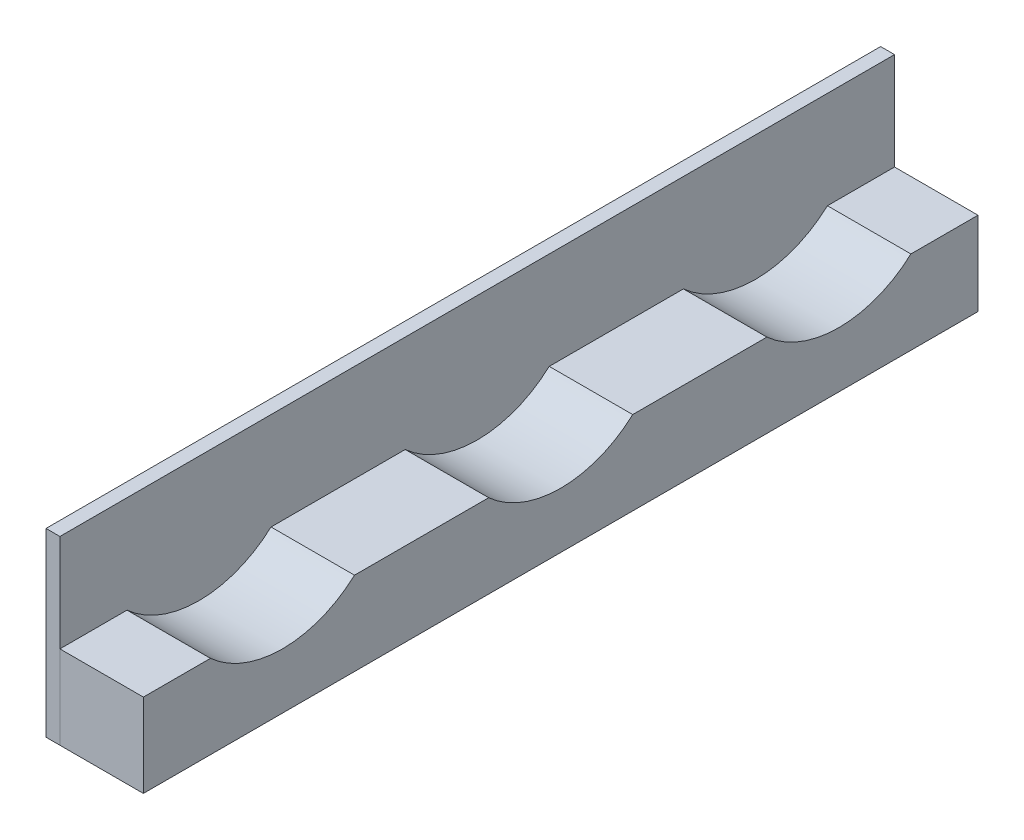
ISO-10303-21;
HEADER;
FILE_DESCRIPTION(('STEP AP214'),'2;1');
FILE_NAME('part.step','',(''),(''),'','','');
FILE_SCHEMA(('AUTOMOTIVE_DESIGN { 1 0 10303 214 1 1 1 1 }'));
ENDSEC;
DATA;
#1=APPLICATION_CONTEXT('core data for automotive mechanical design processes');
#2=APPLICATION_PROTOCOL_DEFINITION('international standard','automotive_design',2000,#1);
#3=PRODUCT_CONTEXT('',#1,'mechanical');
#4=PRODUCT('Part','Part','',(#3));
#5=PRODUCT_RELATED_PRODUCT_CATEGORY('part','',(#4));
#6=PRODUCT_DEFINITION_FORMATION('','',#4);
#7=PRODUCT_DEFINITION_CONTEXT('part definition',#1,'design');
#8=PRODUCT_DEFINITION('design','',#6,#7);
#9=PRODUCT_DEFINITION_SHAPE('','',#8);
#10=(LENGTH_UNIT() NAMED_UNIT(*) SI_UNIT(.MILLI.,.METRE.));
#11=(NAMED_UNIT(*) PLANE_ANGLE_UNIT() SI_UNIT($,.RADIAN.));
#12=(NAMED_UNIT(*) SI_UNIT($,.STERADIAN.) SOLID_ANGLE_UNIT());
#13=UNCERTAINTY_MEASURE_WITH_UNIT(LENGTH_MEASURE(1.E-05),#10,'distance_accuracy_value','');
#14=(GEOMETRIC_REPRESENTATION_CONTEXT(3) GLOBAL_UNCERTAINTY_ASSIGNED_CONTEXT((#13)) GLOBAL_UNIT_ASSIGNED_CONTEXT((#10,
#11,#12)) REPRESENTATION_CONTEXT('',''));
#15=CARTESIAN_POINT('',(0.,0.,0.));
#16=DIRECTION('',(0.,0.,1.));
#17=DIRECTION('',(1.,0.,0.));
#18=AXIS2_PLACEMENT_3D('',#15,#16,#17);
#19=CARTESIAN_POINT('',(22.,69.99,0.00999999999999446));
#20=DIRECTION('',(1.,0.,0.));
#21=DIRECTION('',(0.,0.,-1.));
#22=AXIS2_PLACEMENT_3D('',#19,#20,#21);
#23=PLANE('',#22);
#24=DIRECTION('',(0.,0.,-1.));
#25=VECTOR('',#24,1.);
#26=CARTESIAN_POINT('',(22.,100.,-99.9999999999997));
#27=LINE('',#26,#25);
#28=CARTESIAN_POINT('',(22.,100.,-75.8843582110894));
#29=VERTEX_POINT('',#28);
#30=CARTESIAN_POINT('',(22.,100.,-124.11564178891));
#31=VERTEX_POINT('',#30);
#32=EDGE_CURVE('P0_E104',#29,#31,#27,.T.);
#33=ORIENTED_EDGE('',*,*,#32,.F.);
#34=CARTESIAN_POINT('',(22.,128.5,-49.9999999999999));
#35=DIRECTION('',(1.,0.,0.));
#36=DIRECTION('',(0.,1.,0.));
#37=AXIS2_PLACEMENT_3D('',#34,#35,#36);
#38=CIRCLE('',#37,38.5);
#39=CARTESIAN_POINT('',(22.,100.,-24.1156417889104));
#40=VERTEX_POINT('',#39);
#41=EDGE_CURVE('P0_E21',#40,#29,#38,.T.);
#42=ORIENTED_EDGE('',*,*,#41,.F.);
#43=DIRECTION('',(0.,0.,-1.));
#44=VECTOR('',#43,1.);
#45=CARTESIAN_POINT('',(22.,100.,-12.0578208944552));
#46=LINE('',#45,#44);
#47=CARTESIAN_POINT('',(22.,100.,0.));
#48=VERTEX_POINT('',#47);
#49=EDGE_CURVE('P0_E90',#48,#40,#46,.T.);
#50=ORIENTED_EDGE('',*,*,#49,.F.);
#51=DIRECTION('',(0.,1.,0.));
#52=VECTOR('',#51,1.);
#53=CARTESIAN_POINT('',(22.,85.,0.));
#54=LINE('',#53,#52);
#55=CARTESIAN_POINT('',(22.,70.,0.));
#56=VERTEX_POINT('',#55);
#57=EDGE_CURVE('P0_E124',#56,#48,#54,.T.);
#58=ORIENTED_EDGE('',*,*,#57,.F.);
#59=DIRECTION('',(0.,0.,1.));
#60=VECTOR('',#59,1.);
#61=CARTESIAN_POINT('',(22.,70.,-150.));
#62=LINE('',#61,#60);
#63=CARTESIAN_POINT('',(22.,70.,-300.));
#64=VERTEX_POINT('',#63);
#65=EDGE_CURVE('P0_E137',#64,#56,#62,.T.);
#66=ORIENTED_EDGE('',*,*,#65,.F.);
#67=DIRECTION('',(0.,-1.,0.));
#68=VECTOR('',#67,1.);
#69=CARTESIAN_POINT('',(22.,85.,-300.));
#70=LINE('',#69,#68);
#71=CARTESIAN_POINT('',(22.,100.,-300.));
#72=VERTEX_POINT('',#71);
#73=EDGE_CURVE('P0_E151',#72,#64,#70,.T.);
#74=ORIENTED_EDGE('',*,*,#73,.F.);
#75=DIRECTION('',(0.,0.,-1.));
#76=VECTOR('',#75,1.);
#77=CARTESIAN_POINT('',(22.,100.,-287.942179105545));
#78=LINE('',#77,#76);
#79=CARTESIAN_POINT('',(22.,100.,-275.88435821109));
#80=VERTEX_POINT('',#79);
#81=EDGE_CURVE('P0_E158',#80,#72,#78,.T.);
#82=ORIENTED_EDGE('',*,*,#81,.F.);
#83=CARTESIAN_POINT('',(22.,128.500000000001,-250.));
#84=DIRECTION('',(1.,0.,0.));
#85=DIRECTION('',(0.,0.,-1.));
#86=AXIS2_PLACEMENT_3D('',#83,#84,#85);
#87=CIRCLE('',#86,38.5000000000009);
#88=CARTESIAN_POINT('',(22.,100.,-224.11564178891));
#89=VERTEX_POINT('',#88);
#90=EDGE_CURVE('P0_E177',#89,#80,#87,.T.);
#91=ORIENTED_EDGE('',*,*,#90,.F.);
#92=DIRECTION('',(0.,0.,-1.));
#93=VECTOR('',#92,1.);
#94=CARTESIAN_POINT('',(22.,100.,-200.));
#95=LINE('',#94,#93);
#96=CARTESIAN_POINT('',(22.,100.,-175.88435821109));
#97=VERTEX_POINT('',#96);
#98=EDGE_CURVE('P0_E163',#97,#89,#95,.T.);
#99=ORIENTED_EDGE('',*,*,#98,.F.);
#100=CARTESIAN_POINT('',(22.,128.500000000001,-150.));
#101=DIRECTION('',(1.,0.,0.));
#102=DIRECTION('',(0.,0.,-1.));
#103=AXIS2_PLACEMENT_3D('',#100,#101,#102);
#104=CIRCLE('',#103,38.500000000001);
#105=EDGE_CURVE('P0_E106',#31,#97,#104,.T.);
#106=ORIENTED_EDGE('',*,*,#105,.F.);
#107=EDGE_LOOP('',(#33,#42,#50,#58,#66,#74,#82,#91,#99,#106));
#108=FACE_BOUND('',#107,.T.);
#109=ADVANCED_FACE('P0_F17',(#108),#23,.T.);
#110=CARTESIAN_POINT('',(-8.01,100.,-24.1256417889104));
#111=DIRECTION('',(0.,1.,0.));
#112=DIRECTION('',(0.,0.,1.));
#113=AXIS2_PLACEMENT_3D('',#110,#111,#112);
#114=PLANE('',#113);
#115=DIRECTION('',(1.,0.,0.));
#116=VECTOR('',#115,1.);
#117=CARTESIAN_POINT('',(7.,100.,-24.1156417889104));
#118=LINE('',#117,#116);
#119=CARTESIAN_POINT('',(-8.,100.,-24.1156417889104));
#120=VERTEX_POINT('',#119);
#121=EDGE_CURVE('P0_E101',#120,#40,#118,.T.);
#122=ORIENTED_EDGE('',*,*,#121,.F.);
#123=DIRECTION('',(0.,0.,-1.));
#124=VECTOR('',#123,1.);
#125=CARTESIAN_POINT('',(-8.,100.,-150.));
#126=LINE('',#125,#124);
#127=CARTESIAN_POINT('',(-8.,100.,0.));
#128=VERTEX_POINT('',#127);
#129=EDGE_CURVE('P0_E123',#128,#120,#126,.T.);
#130=ORIENTED_EDGE('',*,*,#129,.F.);
#131=DIRECTION('',(-1.,0.,0.));
#132=VECTOR('',#131,1.);
#133=CARTESIAN_POINT('',(7.,100.,0.));
#134=LINE('',#133,#132);
#135=EDGE_CURVE('P0_E120',#48,#128,#134,.T.);
#136=ORIENTED_EDGE('',*,*,#135,.F.);
#137=ORIENTED_EDGE('',*,*,#49,.T.);
#138=EDGE_LOOP('',(#122,#130,#136,#137));
#139=FACE_BOUND('',#138,.T.);
#140=ADVANCED_FACE('P0_F304',(#139),#114,.T.);
#141=CARTESIAN_POINT('',(-8.,128.5,-49.9999999999999));
#142=DIRECTION('',(1.,0.,0.));
#143=DIRECTION('',(0.,1.,0.));
#144=AXIS2_PLACEMENT_3D('',#141,#142,#143);
#145=CYLINDRICAL_SURFACE('',#144,38.5);
#146=DIRECTION('',(1.,0.,0.));
#147=VECTOR('',#146,1.);
#148=CARTESIAN_POINT('',(7.,100.,-75.8843582110895));
#149=LINE('',#148,#147);
#150=CARTESIAN_POINT('',(-8.,100.,-75.8843582110894));
#151=VERTEX_POINT('',#150);
#152=EDGE_CURVE('P0_E99',#151,#29,#149,.T.);
#153=ORIENTED_EDGE('',*,*,#152,.F.);
#154=CARTESIAN_POINT('',(-8.,128.5,-49.9999999999999));
#155=DIRECTION('',(1.,0.,0.));
#156=DIRECTION('',(0.,1.,0.));
#157=AXIS2_PLACEMENT_3D('',#154,#155,#156);
#158=CIRCLE('',#157,38.5);
#159=EDGE_CURVE('P0_E175',#120,#151,#158,.T.);
#160=ORIENTED_EDGE('',*,*,#159,.F.);
#161=ORIENTED_EDGE('',*,*,#121,.T.);
#162=ORIENTED_EDGE('',*,*,#41,.T.);
#163=EDGE_LOOP('',(#153,#160,#161,#162));
#164=FACE_BOUND('',#163,.T.);
#165=ADVANCED_FACE('P0_F96',(#164),#145,.F.);
#166=CARTESIAN_POINT('',(-8.01,100.,-124.12564178891));
#167=DIRECTION('',(0.,1.,0.));
#168=DIRECTION('',(0.,0.,1.));
#169=AXIS2_PLACEMENT_3D('',#166,#167,#168);
#170=PLANE('',#169);
#171=DIRECTION('',(1.,0.,0.));
#172=VECTOR('',#171,1.);
#173=CARTESIAN_POINT('',(7.,100.,-124.11564178891));
#174=LINE('',#173,#172);
#175=CARTESIAN_POINT('',(-8.,100.,-124.11564178891));
#176=VERTEX_POINT('',#175);
#177=EDGE_CURVE('P0_E109',#176,#31,#174,.T.);
#178=ORIENTED_EDGE('',*,*,#177,.F.);
#179=DIRECTION('',(0.,0.,-1.));
#180=VECTOR('',#179,1.);
#181=CARTESIAN_POINT('',(-8.,100.,-150.));
#182=LINE('',#181,#180);
#183=EDGE_CURVE('P0_E113',#151,#176,#182,.T.);
#184=ORIENTED_EDGE('',*,*,#183,.F.);
#185=ORIENTED_EDGE('',*,*,#152,.T.);
#186=ORIENTED_EDGE('',*,*,#32,.T.);
#187=EDGE_LOOP('',(#178,#184,#185,#186));
#188=FACE_BOUND('',#187,.T.);
#189=ADVANCED_FACE('P0_F111',(#188),#170,.T.);
#190=CARTESIAN_POINT('',(-8.,128.500000000001,-150.));
#191=DIRECTION('',(1.,0.,0.));
#192=DIRECTION('',(0.,0.,-1.));
#193=AXIS2_PLACEMENT_3D('',#190,#191,#192);
#194=CYLINDRICAL_SURFACE('',#193,38.500000000001);
#195=DIRECTION('',(1.,0.,0.));
#196=VECTOR('',#195,1.);
#197=CARTESIAN_POINT('',(7.,100.,-175.88435821109));
#198=LINE('',#197,#196);
#199=CARTESIAN_POINT('',(-8.,100.,-175.88435821109));
#200=VERTEX_POINT('',#199);
#201=EDGE_CURVE('P0_E165',#200,#97,#198,.T.);
#202=ORIENTED_EDGE('',*,*,#201,.F.);
#203=CARTESIAN_POINT('',(-8.,128.500000000001,-150.));
#204=DIRECTION('',(1.,0.,0.));
#205=DIRECTION('',(0.,0.,-1.));
#206=AXIS2_PLACEMENT_3D('',#203,#204,#205);
#207=CIRCLE('',#206,38.500000000001);
#208=EDGE_CURVE('P0_E172',#176,#200,#207,.T.);
#209=ORIENTED_EDGE('',*,*,#208,.F.);
#210=ORIENTED_EDGE('',*,*,#177,.T.);
#211=ORIENTED_EDGE('',*,*,#105,.T.);
#212=EDGE_LOOP('',(#202,#209,#210,#211));
#213=FACE_BOUND('',#212,.T.);
#214=ADVANCED_FACE('P0_F181',(#213),#194,.F.);
#215=CARTESIAN_POINT('',(-8.01,100.,-224.12564178891));
#216=DIRECTION('',(0.,1.,0.));
#217=DIRECTION('',(0.,0.,1.));
#218=AXIS2_PLACEMENT_3D('',#215,#216,#217);
#219=PLANE('',#218);
#220=DIRECTION('',(1.,0.,0.));
#221=VECTOR('',#220,1.);
#222=CARTESIAN_POINT('',(7.,100.,-224.11564178891));
#223=LINE('',#222,#221);
#224=CARTESIAN_POINT('',(-8.,100.,-224.11564178891));
#225=VERTEX_POINT('',#224);
#226=EDGE_CURVE('P0_E164',#225,#89,#223,.T.);
#227=ORIENTED_EDGE('',*,*,#226,.F.);
#228=DIRECTION('',(0.,0.,-1.));
#229=VECTOR('',#228,1.);
#230=CARTESIAN_POINT('',(-8.,100.,-150.));
#231=LINE('',#230,#229);
#232=EDGE_CURVE('P0_E171',#200,#225,#231,.T.);
#233=ORIENTED_EDGE('',*,*,#232,.F.);
#234=ORIENTED_EDGE('',*,*,#201,.T.);
#235=ORIENTED_EDGE('',*,*,#98,.T.);
#236=EDGE_LOOP('',(#227,#233,#234,#235));
#237=FACE_BOUND('',#236,.T.);
#238=ADVANCED_FACE('P0_F210',(#237),#219,.T.);
#239=CARTESIAN_POINT('',(-8.,128.500000000001,-250.));
#240=DIRECTION('',(1.,0.,0.));
#241=DIRECTION('',(0.,0.,-1.));
#242=AXIS2_PLACEMENT_3D('',#239,#240,#241);
#243=CYLINDRICAL_SURFACE('',#242,38.5000000000009);
#244=DIRECTION('',(1.,0.,0.));
#245=VECTOR('',#244,1.);
#246=CARTESIAN_POINT('',(7.,100.,-275.88435821109));
#247=LINE('',#246,#245);
#248=CARTESIAN_POINT('',(-8.,100.,-275.88435821109));
#249=VERTEX_POINT('',#248);
#250=EDGE_CURVE('P0_E160',#249,#80,#247,.T.);
#251=ORIENTED_EDGE('',*,*,#250,.F.);
#252=CARTESIAN_POINT('',(-8.,128.500000000001,-250.));
#253=DIRECTION('',(1.,0.,0.));
#254=DIRECTION('',(0.,0.,-1.));
#255=AXIS2_PLACEMENT_3D('',#252,#253,#254);
#256=CIRCLE('',#255,38.5000000000009);
#257=EDGE_CURVE('P0_E167',#225,#249,#256,.T.);
#258=ORIENTED_EDGE('',*,*,#257,.F.);
#259=ORIENTED_EDGE('',*,*,#226,.T.);
#260=ORIENTED_EDGE('',*,*,#90,.T.);
#261=EDGE_LOOP('',(#251,#258,#259,#260));
#262=FACE_BOUND('',#261,.T.);
#263=ADVANCED_FACE('P0_F206',(#262),#243,.F.);
#264=CARTESIAN_POINT('',(-8.01,100.,-300.01));
#265=DIRECTION('',(0.,1.,0.));
#266=DIRECTION('',(0.,0.,1.));
#267=AXIS2_PLACEMENT_3D('',#264,#265,#266);
#268=PLANE('',#267);
#269=DIRECTION('',(1.,0.,0.));
#270=VECTOR('',#269,1.);
#271=CARTESIAN_POINT('',(7.,100.,-300.));
#272=LINE('',#271,#270);
#273=CARTESIAN_POINT('',(-8.,100.,-300.));
#274=VERTEX_POINT('',#273);
#275=EDGE_CURVE('P0_E155',#274,#72,#272,.T.);
#276=ORIENTED_EDGE('',*,*,#275,.F.);
#277=DIRECTION('',(0.,0.,-1.));
#278=VECTOR('',#277,1.);
#279=CARTESIAN_POINT('',(-8.,100.,-150.));
#280=LINE('',#279,#278);
#281=EDGE_CURVE('P0_E170',#249,#274,#280,.T.);
#282=ORIENTED_EDGE('',*,*,#281,.F.);
#283=ORIENTED_EDGE('',*,*,#250,.T.);
#284=ORIENTED_EDGE('',*,*,#81,.T.);
#285=EDGE_LOOP('',(#276,#282,#283,#284));
#286=FACE_BOUND('',#285,.T.);
#287=ADVANCED_FACE('P0_F215',(#286),#268,.T.);
#288=CARTESIAN_POINT('',(-8.01,69.99,-300.));
#289=DIRECTION('',(0.,0.,-1.));
#290=DIRECTION('',(0.,1.,0.));
#291=AXIS2_PLACEMENT_3D('',#288,#289,#290);
#292=PLANE('',#291);
#293=DIRECTION('',(1.,0.,0.));
#294=VECTOR('',#293,1.);
#295=CARTESIAN_POINT('',(7.,70.,-300.));
#296=LINE('',#295,#294);
#297=CARTESIAN_POINT('',(-8.,70.,-300.));
#298=VERTEX_POINT('',#297);
#299=EDGE_CURVE('P0_E141',#298,#64,#296,.T.);
#300=ORIENTED_EDGE('',*,*,#299,.F.);
#301=DIRECTION('',(0.,-1.,0.));
#302=VECTOR('',#301,1.);
#303=CARTESIAN_POINT('',(-8.,85.,-300.));
#304=LINE('',#303,#302);
#305=EDGE_CURVE('P0_E146',#274,#298,#304,.T.);
#306=ORIENTED_EDGE('',*,*,#305,.F.);
#307=ORIENTED_EDGE('',*,*,#275,.T.);
#308=ORIENTED_EDGE('',*,*,#73,.T.);
#309=EDGE_LOOP('',(#300,#306,#307,#308));
#310=FACE_BOUND('',#309,.T.);
#311=ADVANCED_FACE('P0_F221',(#310),#292,.T.);
#312=CARTESIAN_POINT('',(-8.01,70.,0.01));
#313=DIRECTION('',(0.,-1.,0.));
#314=DIRECTION('',(0.,0.,-1.));
#315=AXIS2_PLACEMENT_3D('',#312,#313,#314);
#316=PLANE('',#315);
#317=DIRECTION('',(1.,0.,0.));
#318=VECTOR('',#317,1.);
#319=CARTESIAN_POINT('',(7.,70.,0.));
#320=LINE('',#319,#318);
#321=CARTESIAN_POINT('',(-8.,70.,0.));
#322=VERTEX_POINT('',#321);
#323=EDGE_CURVE('P0_E36',#322,#56,#320,.T.);
#324=ORIENTED_EDGE('',*,*,#323,.F.);
#325=DIRECTION('',(0.,0.,1.));
#326=VECTOR('',#325,1.);
#327=CARTESIAN_POINT('',(-8.,70.,-150.));
#328=LINE('',#327,#326);
#329=EDGE_CURVE('P0_E27',#298,#322,#328,.T.);
#330=ORIENTED_EDGE('',*,*,#329,.F.);
#331=ORIENTED_EDGE('',*,*,#299,.T.);
#332=ORIENTED_EDGE('',*,*,#65,.T.);
#333=EDGE_LOOP('',(#324,#330,#331,#332));
#334=FACE_BOUND('',#333,.T.);
#335=ADVANCED_FACE('P0_F222',(#334),#316,.T.);
#336=CARTESIAN_POINT('',(-8.01,100.01,0.));
#337=DIRECTION('',(0.,0.,1.));
#338=DIRECTION('',(0.,-1.,0.));
#339=AXIS2_PLACEMENT_3D('',#336,#337,#338);
#340=PLANE('',#339);
#341=ORIENTED_EDGE('',*,*,#135,.T.);
#342=DIRECTION('',(0.,1.,0.));
#343=VECTOR('',#342,1.);
#344=CARTESIAN_POINT('',(-8.,85.,0.));
#345=LINE('',#344,#343);
#346=EDGE_CURVE('P0_E11',#322,#128,#345,.T.);
#347=ORIENTED_EDGE('',*,*,#346,.F.);
#348=ORIENTED_EDGE('',*,*,#323,.T.);
#349=ORIENTED_EDGE('',*,*,#57,.T.);
#350=EDGE_LOOP('',(#341,#347,#348,#349));
#351=FACE_BOUND('',#350,.T.);
#352=ADVANCED_FACE('P0_F224',(#351),#340,.T.);
#353=CARTESIAN_POINT('',(-8.,69.99,-300.01));
#354=DIRECTION('',(-1.,0.,0.));
#355=DIRECTION('',(0.,0.,1.));
#356=AXIS2_PLACEMENT_3D('',#353,#354,#355);
#357=PLANE('',#356);
#358=ORIENTED_EDGE('',*,*,#329,.T.);
#359=ORIENTED_EDGE('',*,*,#346,.T.);
#360=ORIENTED_EDGE('',*,*,#129,.T.);
#361=ORIENTED_EDGE('',*,*,#159,.T.);
#362=ORIENTED_EDGE('',*,*,#183,.T.);
#363=ORIENTED_EDGE('',*,*,#208,.T.);
#364=ORIENTED_EDGE('',*,*,#232,.T.);
#365=ORIENTED_EDGE('',*,*,#257,.T.);
#366=ORIENTED_EDGE('',*,*,#281,.T.);
#367=ORIENTED_EDGE('',*,*,#305,.T.);
#368=EDGE_LOOP('',(#358,#359,#360,#361,#362,#363,#364,#365,#366,#367));
#369=FACE_BOUND('',#368,.T.);
#370=ADVANCED_FACE('P0_F19',(#369),#357,.T.);
#371=CLOSED_SHELL('',(#109,#140,#165,#189,#214,#238,#263,#287,#311,#335,#352,#370));
#372=MANIFOLD_SOLID_BREP('P0_B1',#371);
#373=CARTESIAN_POINT('',(-7.99,135.,0.01));
#374=DIRECTION('',(0.,1.,0.));
#375=DIRECTION('',(0.,0.,-1.));
#376=AXIS2_PLACEMENT_3D('',#373,#374,#375);
#377=PLANE('',#376);
#378=DIRECTION('',(0.,0.,-1.));
#379=VECTOR('',#378,1.);
#380=CARTESIAN_POINT('',(-13.,135.,-150.));
#381=LINE('',#380,#379);
#382=CARTESIAN_POINT('',(-13.,135.,0.));
#383=VERTEX_POINT('',#382);
#384=CARTESIAN_POINT('',(-13.,135.,-300.));
#385=VERTEX_POINT('',#384);
#386=EDGE_CURVE('P1_E69',#383,#385,#381,.T.);
#387=ORIENTED_EDGE('',*,*,#386,.F.);
#388=DIRECTION('',(-1.,0.,0.));
#389=VECTOR('',#388,1.);
#390=CARTESIAN_POINT('',(-10.5,135.,0.));
#391=LINE('',#390,#389);
#392=CARTESIAN_POINT('',(-8.,135.,0.));
#393=VERTEX_POINT('',#392);
#394=EDGE_CURVE('P1_E56',#393,#383,#391,.T.);
#395=ORIENTED_EDGE('',*,*,#394,.F.);
#396=DIRECTION('',(0.,0.,1.));
#397=VECTOR('',#396,1.);
#398=CARTESIAN_POINT('',(-8.,135.,-150.));
#399=LINE('',#398,#397);
#400=CARTESIAN_POINT('',(-8.,135.,-300.));
#401=VERTEX_POINT('',#400);
#402=EDGE_CURVE('P1_E21',#401,#393,#399,.T.);
#403=ORIENTED_EDGE('',*,*,#402,.F.);
#404=DIRECTION('',(1.,0.,0.));
#405=VECTOR('',#404,1.);
#406=CARTESIAN_POINT('',(-10.5,135.,-300.));
#407=LINE('',#406,#405);
#408=EDGE_CURVE('P1_E82',#385,#401,#407,.T.);
#409=ORIENTED_EDGE('',*,*,#408,.F.);
#410=EDGE_LOOP('',(#387,#395,#403,#409));
#411=FACE_BOUND('',#410,.T.);
#412=ADVANCED_FACE('P1_F17',(#411),#377,.T.);
#413=CARTESIAN_POINT('',(-8.,69.99,0.00999999999999446));
#414=DIRECTION('',(1.,0.,0.));
#415=DIRECTION('',(0.,0.,-1.));
#416=AXIS2_PLACEMENT_3D('',#413,#414,#415);
#417=PLANE('',#416);
#418=DIRECTION('',(0.,-1.,0.));
#419=VECTOR('',#418,1.);
#420=CARTESIAN_POINT('',(-8.,102.5,-300.));
#421=LINE('',#420,#419);
#422=CARTESIAN_POINT('',(-8.,70.,-300.));
#423=VERTEX_POINT('',#422);
#424=EDGE_CURVE('P1_E65',#401,#423,#421,.T.);
#425=ORIENTED_EDGE('',*,*,#424,.F.);
#426=ORIENTED_EDGE('',*,*,#402,.T.);
#427=DIRECTION('',(0.,1.,0.));
#428=VECTOR('',#427,1.);
#429=CARTESIAN_POINT('',(-8.,102.5,0.));
#430=LINE('',#429,#428);
#431=CARTESIAN_POINT('',(-8.,70.,0.));
#432=VERTEX_POINT('',#431);
#433=EDGE_CURVE('P1_E62',#432,#393,#430,.T.);
#434=ORIENTED_EDGE('',*,*,#433,.F.);
#435=DIRECTION('',(0.,0.,1.));
#436=VECTOR('',#435,1.);
#437=CARTESIAN_POINT('',(-8.,70.,-150.));
#438=LINE('',#437,#436);
#439=EDGE_CURVE('P1_E84',#423,#432,#438,.T.);
#440=ORIENTED_EDGE('',*,*,#439,.F.);
#441=EDGE_LOOP('',(#425,#426,#434,#440));
#442=FACE_BOUND('',#441,.T.);
#443=ADVANCED_FACE('P1_F61',(#442),#417,.T.);
#444=CARTESIAN_POINT('',(-7.99,69.99,0.));
#445=DIRECTION('',(0.,0.,1.));
#446=DIRECTION('',(0.,1.,0.));
#447=AXIS2_PLACEMENT_3D('',#444,#445,#446);
#448=PLANE('',#447);
#449=DIRECTION('',(0.,1.,0.));
#450=VECTOR('',#449,1.);
#451=CARTESIAN_POINT('',(-13.,102.5,0.));
#452=LINE('',#451,#450);
#453=CARTESIAN_POINT('',(-13.,70.,0.));
#454=VERTEX_POINT('',#453);
#455=EDGE_CURVE('P1_E71',#454,#383,#452,.T.);
#456=ORIENTED_EDGE('',*,*,#455,.F.);
#457=DIRECTION('',(-1.,0.,0.));
#458=VECTOR('',#457,1.);
#459=CARTESIAN_POINT('',(-10.5,70.,0.));
#460=LINE('',#459,#458);
#461=EDGE_CURVE('P1_E75',#432,#454,#460,.T.);
#462=ORIENTED_EDGE('',*,*,#461,.F.);
#463=ORIENTED_EDGE('',*,*,#433,.T.);
#464=ORIENTED_EDGE('',*,*,#394,.T.);
#465=EDGE_LOOP('',(#456,#462,#463,#464));
#466=FACE_BOUND('',#465,.T.);
#467=ADVANCED_FACE('P1_F73',(#466),#448,.T.);
#468=CARTESIAN_POINT('',(-13.,69.99,-300.01));
#469=DIRECTION('',(-1.,0.,0.));
#470=DIRECTION('',(0.,0.,1.));
#471=AXIS2_PLACEMENT_3D('',#468,#469,#470);
#472=PLANE('',#471);
#473=DIRECTION('',(0.,1.,0.));
#474=VECTOR('',#473,1.);
#475=CARTESIAN_POINT('',(-13.,102.5,-300.));
#476=LINE('',#475,#474);
#477=CARTESIAN_POINT('',(-13.,70.,-300.));
#478=VERTEX_POINT('',#477);
#479=EDGE_CURVE('P1_E36',#478,#385,#476,.T.);
#480=ORIENTED_EDGE('',*,*,#479,.F.);
#481=DIRECTION('',(0.,0.,-1.));
#482=VECTOR('',#481,1.);
#483=CARTESIAN_POINT('',(-13.,70.,-150.));
#484=LINE('',#483,#482);
#485=EDGE_CURVE('P1_E27',#454,#478,#484,.T.);
#486=ORIENTED_EDGE('',*,*,#485,.F.);
#487=ORIENTED_EDGE('',*,*,#455,.T.);
#488=ORIENTED_EDGE('',*,*,#386,.T.);
#489=EDGE_LOOP('',(#480,#486,#487,#488));
#490=FACE_BOUND('',#489,.T.);
#491=ADVANCED_FACE('P1_F89',(#490),#472,.T.);
#492=CARTESIAN_POINT('',(-7.99,135.01,-300.));
#493=DIRECTION('',(0.,0.,-1.));
#494=DIRECTION('',(0.,-1.,0.));
#495=AXIS2_PLACEMENT_3D('',#492,#493,#494);
#496=PLANE('',#495);
#497=ORIENTED_EDGE('',*,*,#479,.T.);
#498=ORIENTED_EDGE('',*,*,#408,.T.);
#499=ORIENTED_EDGE('',*,*,#424,.T.);
#500=DIRECTION('',(1.,0.,0.));
#501=VECTOR('',#500,1.);
#502=CARTESIAN_POINT('',(-10.5,70.,-300.));
#503=LINE('',#502,#501);
#504=EDGE_CURVE('P1_E11',#478,#423,#503,.T.);
#505=ORIENTED_EDGE('',*,*,#504,.F.);
#506=EDGE_LOOP('',(#497,#498,#499,#505));
#507=FACE_BOUND('',#506,.T.);
#508=ADVANCED_FACE('P1_F91',(#507),#496,.T.);
#509=CARTESIAN_POINT('',(-7.99,70.,-300.01));
#510=DIRECTION('',(0.,-1.,0.));
#511=DIRECTION('',(0.,0.,1.));
#512=AXIS2_PLACEMENT_3D('',#509,#510,#511);
#513=PLANE('',#512);
#514=ORIENTED_EDGE('',*,*,#485,.T.);
#515=ORIENTED_EDGE('',*,*,#504,.T.);
#516=ORIENTED_EDGE('',*,*,#439,.T.);
#517=ORIENTED_EDGE('',*,*,#461,.T.);
#518=EDGE_LOOP('',(#514,#515,#516,#517));
#519=FACE_BOUND('',#518,.T.);
#520=ADVANCED_FACE('P1_F19',(#519),#513,.T.);
#521=CLOSED_SHELL('',(#412,#443,#467,#491,#508,#520));
#522=MANIFOLD_SOLID_BREP('P1_B1',#521);
#523=ADVANCED_BREP_SHAPE_REPRESENTATION('',(#18,#372,#522),#14);
#524=SHAPE_DEFINITION_REPRESENTATION(#9,#523);
ENDSEC;
END-ISO-10303-21;
